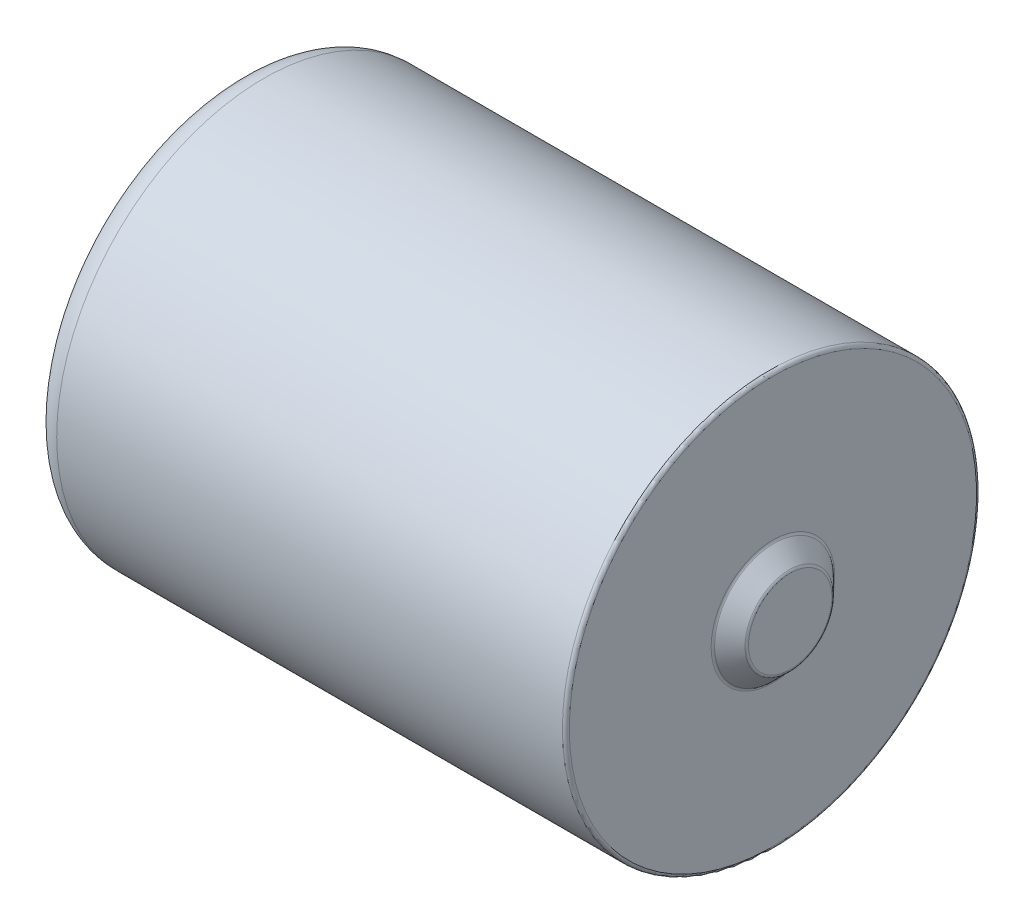
ISO-10303-21;
HEADER;
FILE_DESCRIPTION(('STEP AP214'),'2;1');
FILE_NAME('part.step','',(''),(''),'','','');
FILE_SCHEMA(('AUTOMOTIVE_DESIGN { 1 0 10303 214 1 1 1 1 }'));
ENDSEC;
DATA;
#1=APPLICATION_CONTEXT('core data for automotive mechanical design processes');
#2=APPLICATION_PROTOCOL_DEFINITION('international standard','automotive_design',2000,#1);
#3=PRODUCT_CONTEXT('',#1,'mechanical');
#4=PRODUCT('Part','Part','',(#3));
#5=PRODUCT_RELATED_PRODUCT_CATEGORY('part','',(#4));
#6=PRODUCT_DEFINITION_FORMATION('','',#4);
#7=PRODUCT_DEFINITION_CONTEXT('part definition',#1,'design');
#8=PRODUCT_DEFINITION('design','',#6,#7);
#9=PRODUCT_DEFINITION_SHAPE('','',#8);
#10=(LENGTH_UNIT() NAMED_UNIT(*) SI_UNIT(.MILLI.,.METRE.));
#11=(NAMED_UNIT(*) PLANE_ANGLE_UNIT() SI_UNIT($,.RADIAN.));
#12=(NAMED_UNIT(*) SI_UNIT($,.STERADIAN.) SOLID_ANGLE_UNIT());
#13=UNCERTAINTY_MEASURE_WITH_UNIT(LENGTH_MEASURE(1.E-05),#10,'distance_accuracy_value','');
#14=(GEOMETRIC_REPRESENTATION_CONTEXT(3) GLOBAL_UNCERTAINTY_ASSIGNED_CONTEXT((#13)) GLOBAL_UNIT_ASSIGNED_CONTEXT((#10,
#11,#12)) REPRESENTATION_CONTEXT('',''));
#15=CARTESIAN_POINT('',(0.,0.,0.));
#16=DIRECTION('',(0.,0.,1.));
#17=DIRECTION('',(1.,0.,0.));
#18=AXIS2_PLACEMENT_3D('',#15,#16,#17);
#19=CARTESIAN_POINT('',(0.,0.,0.));
#20=DIRECTION('',(-1.,0.,0.));
#21=DIRECTION('',(0.,0.,1.));
#22=AXIS2_PLACEMENT_3D('',#19,#20,#21);
#23=CYLINDRICAL_SURFACE('',#22,2.75);
#24=CARTESIAN_POINT('',(3.32679442143429,0.,0.));
#25=DIRECTION('',(1.,0.,0.));
#26=DIRECTION('',(0.,0.,-1.));
#27=AXIS2_PLACEMENT_3D('',#24,#25,#26);
#28=CIRCLE('',#27,2.75);
#29=CARTESIAN_POINT('',(3.32679442143429,0.,-2.75));
#30=VERTEX_POINT('',#29);
#31=EDGE_CURVE('E49',#30,#30,#28,.F.);
#32=ORIENTED_EDGE('',*,*,#31,.T.);
#33=EDGE_LOOP('',(#32));
#34=FACE_BOUND('',#33,.T.);
#35=CARTESIAN_POINT('',(3.62679442143429,0.,0.));
#36=DIRECTION('',(-1.,0.,0.));
#37=DIRECTION('',(0.,0.,1.));
#38=AXIS2_PLACEMENT_3D('',#35,#36,#37);
#39=CIRCLE('',#38,2.75);
#40=CARTESIAN_POINT('',(3.62679442143429,0.,2.75));
#41=VERTEX_POINT('',#40);
#42=EDGE_CURVE('E90',#41,#41,#39,.T.);
#43=ORIENTED_EDGE('',*,*,#42,.F.);
#44=EDGE_LOOP('',(#43));
#45=FACE_BOUND('',#44,.T.);
#46=ADVANCED_FACE('F35',(#34,#45),#23,.F.);
#47=CARTESIAN_POINT('',(3.12679442143429,2.75,0.));
#48=DIRECTION('',(1.,0.,0.));
#49=DIRECTION('',(0.,0.,-1.));
#50=AXIS2_PLACEMENT_3D('',#47,#48,#49);
#51=PLANE('',#50);
#52=CARTESIAN_POINT('',(3.12679442143429,0.,0.));
#53=DIRECTION('',(1.,0.,0.));
#54=DIRECTION('',(0.,0.,-1.));
#55=AXIS2_PLACEMENT_3D('',#52,#53,#54);
#56=CIRCLE('',#55,3.05);
#57=CARTESIAN_POINT('',(3.12679442143429,0.,-3.05));
#58=VERTEX_POINT('',#57);
#59=EDGE_CURVE('E60',#58,#58,#56,.F.);
#60=ORIENTED_EDGE('',*,*,#59,.T.);
#61=EDGE_LOOP('',(#60));
#62=FACE_BOUND('',#61,.T.);
#63=CARTESIAN_POINT('',(3.12679442143429,0.,0.));
#64=DIRECTION('',(1.,0.,0.));
#65=DIRECTION('',(0.,0.,-1.));
#66=AXIS2_PLACEMENT_3D('',#63,#64,#65);
#67=CIRCLE('',#66,2.95);
#68=CARTESIAN_POINT('',(3.12679442143429,0.,-2.95));
#69=VERTEX_POINT('',#68);
#70=EDGE_CURVE('E63',#69,#69,#67,.T.);
#71=ORIENTED_EDGE('',*,*,#70,.T.);
#72=EDGE_LOOP('',(#71));
#73=FACE_BOUND('',#72,.T.);
#74=ADVANCED_FACE('F97',(#62,#73),#51,.F.);
#75=CARTESIAN_POINT('',(0.,0.,0.));
#76=DIRECTION('',(-1.,0.,0.));
#77=DIRECTION('',(0.,0.,1.));
#78=AXIS2_PLACEMENT_3D('',#75,#76,#77);
#79=CYLINDRICAL_SURFACE('',#78,3.25);
#80=CARTESIAN_POINT('',(3.32679442143429,0.,0.));
#81=DIRECTION('',(1.,0.,0.));
#82=DIRECTION('',(0.,0.,-1.));
#83=AXIS2_PLACEMENT_3D('',#80,#81,#82);
#84=CIRCLE('',#83,3.25);
#85=CARTESIAN_POINT('',(3.32679442143429,0.,-3.25));
#86=VERTEX_POINT('',#85);
#87=EDGE_CURVE('E54',#86,#86,#84,.T.);
#88=ORIENTED_EDGE('',*,*,#87,.T.);
#89=EDGE_LOOP('',(#88));
#90=FACE_BOUND('',#89,.T.);
#91=CARTESIAN_POINT('',(3.92679442143429,0.,0.));
#92=DIRECTION('',(1.,0.,0.));
#93=DIRECTION('',(0.,0.,-1.));
#94=AXIS2_PLACEMENT_3D('',#91,#92,#93);
#95=CIRCLE('',#94,3.25);
#96=CARTESIAN_POINT('',(3.92679442143429,0.,-3.25));
#97=VERTEX_POINT('',#96);
#98=EDGE_CURVE('E57',#97,#97,#95,.F.);
#99=ORIENTED_EDGE('',*,*,#98,.T.);
#100=EDGE_LOOP('',(#99));
#101=FACE_BOUND('',#100,.T.);
#102=ADVANCED_FACE('F102',(#90,#101),#79,.T.);
#103=CARTESIAN_POINT('',(4.12679442143429,3.25,0.));
#104=DIRECTION('',(1.,0.,0.));
#105=DIRECTION('',(0.,0.,-1.));
#106=AXIS2_PLACEMENT_3D('',#103,#104,#105);
#107=PLANE('',#106);
#108=CARTESIAN_POINT('',(4.12679442143429,0.,0.));
#109=DIRECTION('',(1.,0.,0.));
#110=DIRECTION('',(0.,0.,-1.));
#111=AXIS2_PLACEMENT_3D('',#108,#109,#110);
#112=CIRCLE('',#111,3.45);
#113=CARTESIAN_POINT('',(4.12679442143429,0.,-3.45));
#114=VERTEX_POINT('',#113);
#115=EDGE_CURVE('E45',#114,#114,#112,.T.);
#116=ORIENTED_EDGE('',*,*,#115,.T.);
#117=EDGE_LOOP('',(#116));
#118=FACE_BOUND('',#117,.T.);
#119=CARTESIAN_POINT('',(4.12679442143429,0.,0.));
#120=DIRECTION('',(-1.,0.,0.));
#121=DIRECTION('',(0.,0.,1.));
#122=AXIS2_PLACEMENT_3D('',#119,#120,#121);
#123=CIRCLE('',#122,10.5);
#124=CARTESIAN_POINT('',(4.12679442143429,0.,10.5));
#125=VERTEX_POINT('',#124);
#126=EDGE_CURVE('E78',#125,#125,#123,.T.);
#127=ORIENTED_EDGE('',*,*,#126,.T.);
#128=EDGE_LOOP('',(#127));
#129=FACE_BOUND('',#128,.T.);
#130=ADVANCED_FACE('F160',(#118,#129),#107,.F.);
#131=CARTESIAN_POINT('',(5.62679442143429,0.,0.));
#132=DIRECTION('',(-1.,0.,0.));
#133=DIRECTION('',(0.,0.,1.));
#134=AXIS2_PLACEMENT_3D('',#131,#132,#133);
#135=TOROIDAL_SURFACE('',#134,10.5,1.5);
#136=ORIENTED_EDGE('',*,*,#126,.F.);
#137=EDGE_LOOP('',(#136));
#138=FACE_BOUND('',#137,.T.);
#139=CARTESIAN_POINT('',(5.62679442143429,0.,0.));
#140=DIRECTION('',(-1.,0.,0.));
#141=DIRECTION('',(0.,0.,1.));
#142=AXIS2_PLACEMENT_3D('',#139,#140,#141);
#143=CIRCLE('',#142,12.);
#144=CARTESIAN_POINT('',(5.62679442143429,0.,12.));
#145=VERTEX_POINT('',#144);
#146=EDGE_CURVE('E81',#145,#145,#143,.T.);
#147=ORIENTED_EDGE('',*,*,#146,.T.);
#148=EDGE_LOOP('',(#147));
#149=FACE_BOUND('',#148,.T.);
#150=ADVANCED_FACE('F157',(#138,#149),#135,.T.);
#151=CARTESIAN_POINT('',(0.,0.,0.));
#152=DIRECTION('',(-1.,0.,0.));
#153=DIRECTION('',(0.,0.,1.));
#154=AXIS2_PLACEMENT_3D('',#151,#152,#153);
#155=CYLINDRICAL_SURFACE('',#154,12.);
#156=CARTESIAN_POINT('',(34.9267944214343,0.,0.));
#157=DIRECTION('',(-1.,0.,0.));
#158=DIRECTION('',(0.,0.,1.));
#159=AXIS2_PLACEMENT_3D('',#156,#157,#158);
#160=CIRCLE('',#159,12.);
#161=CARTESIAN_POINT('',(34.9267944214343,0.,12.));
#162=VERTEX_POINT('',#161);
#163=EDGE_CURVE('E41',#162,#162,#160,.T.);
#164=ORIENTED_EDGE('',*,*,#163,.T.);
#165=EDGE_LOOP('',(#164));
#166=FACE_BOUND('',#165,.T.);
#167=ORIENTED_EDGE('',*,*,#146,.F.);
#168=EDGE_LOOP('',(#167));
#169=FACE_BOUND('',#168,.T.);
#170=ADVANCED_FACE('F154',(#166,#169),#155,.T.);
#171=CARTESIAN_POINT('',(35.1267944214343,12.,0.));
#172=DIRECTION('',(-1.,0.,0.));
#173=DIRECTION('',(0.,0.,1.));
#174=AXIS2_PLACEMENT_3D('',#171,#172,#173);
#175=PLANE('',#174);
#176=CARTESIAN_POINT('',(35.1267944214343,0.,0.));
#177=DIRECTION('',(-1.,0.,0.));
#178=DIRECTION('',(0.,0.,1.));
#179=AXIS2_PLACEMENT_3D('',#176,#177,#178);
#180=CIRCLE('',#179,11.8);
#181=CARTESIAN_POINT('',(35.1267944214343,0.,11.8));
#182=VERTEX_POINT('',#181);
#183=EDGE_CURVE('E10',#182,#182,#180,.F.);
#184=ORIENTED_EDGE('',*,*,#183,.T.);
#185=EDGE_LOOP('',(#184));
#186=FACE_BOUND('',#185,.T.);
#187=CARTESIAN_POINT('',(35.1267944214343,0.,0.));
#188=DIRECTION('',(-1.,0.,0.));
#189=DIRECTION('',(0.,0.,1.));
#190=AXIS2_PLACEMENT_3D('',#187,#188,#189);
#191=CIRCLE('',#190,3.58284271247462);
#192=CARTESIAN_POINT('',(35.1267944214343,0.,3.58284271247462));
#193=VERTEX_POINT('',#192);
#194=EDGE_CURVE('E75',#193,#193,#191,.T.);
#195=ORIENTED_EDGE('',*,*,#194,.T.);
#196=EDGE_LOOP('',(#195));
#197=FACE_BOUND('',#196,.T.);
#198=ADVANCED_FACE('F150',(#186,#197),#175,.F.);
#199=CARTESIAN_POINT('',(36.1267944214343,0.,0.));
#200=DIRECTION('',(-1.,0.,0.));
#201=DIRECTION('',(0.,0.,1.));
#202=AXIS2_PLACEMENT_3D('',#199,#200,#201);
#203=CONICAL_SURFACE('',#202,2.5,0.785398163397446);
#204=CARTESIAN_POINT('',(35.185373065197,0.,0.));
#205=DIRECTION('',(-1.,0.,0.));
#206=DIRECTION('',(0.,0.,1.));
#207=AXIS2_PLACEMENT_3D('',#204,#205,#206);
#208=CIRCLE('',#207,3.44142135623731);
#209=CARTESIAN_POINT('',(35.185373065197,0.,3.44142135623731));
#210=VERTEX_POINT('',#209);
#211=EDGE_CURVE('E69',#210,#210,#208,.F.);
#212=ORIENTED_EDGE('',*,*,#211,.T.);
#213=EDGE_LOOP('',(#212));
#214=FACE_BOUND('',#213,.T.);
#215=CARTESIAN_POINT('',(36.0682157776716,0.,0.));
#216=DIRECTION('',(1.,0.,0.));
#217=DIRECTION('',(0.,0.,-1.));
#218=AXIS2_PLACEMENT_3D('',#215,#216,#217);
#219=CIRCLE('',#218,2.55857864376269);
#220=CARTESIAN_POINT('',(36.0682157776716,0.,-2.55857864376269));
#221=VERTEX_POINT('',#220);
#222=EDGE_CURVE('E72',#221,#221,#219,.F.);
#223=ORIENTED_EDGE('',*,*,#222,.T.);
#224=EDGE_LOOP('',(#223));
#225=FACE_BOUND('',#224,.T.);
#226=ADVANCED_FACE('F146',(#214,#225),#203,.T.);
#227=CARTESIAN_POINT('',(36.1267944214343,2.5,0.));
#228=DIRECTION('',(-1.,0.,0.));
#229=DIRECTION('',(0.,0.,1.));
#230=AXIS2_PLACEMENT_3D('',#227,#228,#229);
#231=PLANE('',#230);
#232=CARTESIAN_POINT('',(36.1267944214343,0.,0.));
#233=DIRECTION('',(-1.,0.,0.));
#234=DIRECTION('',(0.,0.,1.));
#235=AXIS2_PLACEMENT_3D('',#232,#233,#234);
#236=CIRCLE('',#235,2.41715728752539);
#237=CARTESIAN_POINT('',(36.1267944214343,0.,2.41715728752539));
#238=VERTEX_POINT('',#237);
#239=EDGE_CURVE('E66',#238,#238,#236,.F.);
#240=ORIENTED_EDGE('',*,*,#239,.T.);
#241=EDGE_LOOP('',(#240));
#242=FACE_BOUND('',#241,.T.);
#243=ADVANCED_FACE('F142',(#242),#231,.F.);
#244=CARTESIAN_POINT('',(21.6466304474587,1.,0.));
#245=DIRECTION('',(1.,0.,0.));
#246=DIRECTION('',(0.,0.,-1.));
#247=AXIS2_PLACEMENT_3D('',#244,#245,#246);
#248=PLANE('',#247);
#249=CARTESIAN_POINT('',(21.6466304474587,0.,0.));
#250=DIRECTION('',(-1.,0.,0.));
#251=DIRECTION('',(0.,0.,1.));
#252=AXIS2_PLACEMENT_3D('',#249,#250,#251);
#253=CIRCLE('',#252,1.);
#254=CARTESIAN_POINT('',(21.6466304474587,0.,1.));
#255=VERTEX_POINT('',#254);
#256=EDGE_CURVE('E84',#255,#255,#253,.T.);
#257=ORIENTED_EDGE('',*,*,#256,.T.);
#258=EDGE_LOOP('',(#257));
#259=FACE_BOUND('',#258,.T.);
#260=ADVANCED_FACE('F138',(#259),#248,.F.);
#261=CARTESIAN_POINT('',(0.,0.,0.));
#262=DIRECTION('',(-1.,0.,0.));
#263=DIRECTION('',(0.,0.,1.));
#264=AXIS2_PLACEMENT_3D('',#261,#262,#263);
#265=CYLINDRICAL_SURFACE('',#264,1.);
#266=ORIENTED_EDGE('',*,*,#256,.F.);
#267=EDGE_LOOP('',(#266));
#268=FACE_BOUND('',#267,.T.);
#269=CARTESIAN_POINT('',(3.62679442143429,0.,0.));
#270=DIRECTION('',(-1.,0.,0.));
#271=DIRECTION('',(0.,0.,1.));
#272=AXIS2_PLACEMENT_3D('',#269,#270,#271);
#273=CIRCLE('',#272,1.);
#274=CARTESIAN_POINT('',(3.62679442143429,0.,1.));
#275=VERTEX_POINT('',#274);
#276=EDGE_CURVE('E87',#275,#275,#273,.T.);
#277=ORIENTED_EDGE('',*,*,#276,.T.);
#278=EDGE_LOOP('',(#277));
#279=FACE_BOUND('',#278,.T.);
#280=ADVANCED_FACE('F134',(#268,#279),#265,.F.);
#281=CARTESIAN_POINT('',(3.62679442143429,1.,0.));
#282=DIRECTION('',(1.,0.,0.));
#283=DIRECTION('',(0.,0.,-1.));
#284=AXIS2_PLACEMENT_3D('',#281,#282,#283);
#285=PLANE('',#284);
#286=ORIENTED_EDGE('',*,*,#276,.F.);
#287=EDGE_LOOP('',(#286));
#288=FACE_BOUND('',#287,.T.);
#289=ORIENTED_EDGE('',*,*,#42,.T.);
#290=EDGE_LOOP('',(#289));
#291=FACE_BOUND('',#290,.T.);
#292=ADVANCED_FACE('F94',(#288,#291),#285,.F.);
#293=CARTESIAN_POINT('',(35.3267944214343,0.,0.));
#294=DIRECTION('',(-1.,0.,0.));
#295=DIRECTION('',(0.,0.,1.));
#296=AXIS2_PLACEMENT_3D('',#293,#294,#295);
#297=TOROIDAL_SURFACE('',#296,3.58284271247462,0.2);
#298=ORIENTED_EDGE('',*,*,#211,.F.);
#299=EDGE_LOOP('',(#298));
#300=FACE_BOUND('',#299,.T.);
#301=ORIENTED_EDGE('',*,*,#194,.F.);
#302=EDGE_LOOP('',(#301));
#303=FACE_BOUND('',#302,.T.);
#304=ADVANCED_FACE('F127',(#300,#303),#297,.F.);
#305=CARTESIAN_POINT('',(35.9267944214343,0.,0.));
#306=DIRECTION('',(-1.,0.,0.));
#307=DIRECTION('',(0.,0.,1.));
#308=AXIS2_PLACEMENT_3D('',#305,#306,#307);
#309=TOROIDAL_SURFACE('',#308,2.41715728752539,0.2);
#310=ORIENTED_EDGE('',*,*,#239,.F.);
#311=EDGE_LOOP('',(#310));
#312=FACE_BOUND('',#311,.T.);
#313=ORIENTED_EDGE('',*,*,#222,.F.);
#314=EDGE_LOOP('',(#313));
#315=FACE_BOUND('',#314,.T.);
#316=ADVANCED_FACE('F119',(#312,#315),#309,.T.);
#317=CARTESIAN_POINT('',(3.32679442143429,0.,0.));
#318=DIRECTION('',(1.,0.,0.));
#319=DIRECTION('',(0.,0.,-1.));
#320=AXIS2_PLACEMENT_3D('',#317,#318,#319);
#321=TOROIDAL_SURFACE('',#320,3.05,0.2);
#322=ORIENTED_EDGE('',*,*,#87,.F.);
#323=EDGE_LOOP('',(#322));
#324=FACE_BOUND('',#323,.T.);
#325=ORIENTED_EDGE('',*,*,#59,.F.);
#326=EDGE_LOOP('',(#325));
#327=FACE_BOUND('',#326,.T.);
#328=ADVANCED_FACE('F109',(#324,#327),#321,.T.);
#329=CARTESIAN_POINT('',(3.32679442143429,0.,0.));
#330=DIRECTION('',(1.,0.,0.));
#331=DIRECTION('',(0.,0.,-1.));
#332=AXIS2_PLACEMENT_3D('',#329,#330,#331);
#333=TOROIDAL_SURFACE('',#332,2.95,0.2);
#334=ORIENTED_EDGE('',*,*,#70,.F.);
#335=EDGE_LOOP('',(#334));
#336=FACE_BOUND('',#335,.T.);
#337=ORIENTED_EDGE('',*,*,#31,.F.);
#338=EDGE_LOOP('',(#337));
#339=FACE_BOUND('',#338,.T.);
#340=ADVANCED_FACE('F106',(#336,#339),#333,.T.);
#341=CARTESIAN_POINT('',(3.92679442143429,0.,0.));
#342=DIRECTION('',(1.,0.,0.));
#343=DIRECTION('',(0.,0.,-1.));
#344=AXIS2_PLACEMENT_3D('',#341,#342,#343);
#345=TOROIDAL_SURFACE('',#344,3.45,0.2);
#346=ORIENTED_EDGE('',*,*,#115,.F.);
#347=EDGE_LOOP('',(#346));
#348=FACE_BOUND('',#347,.T.);
#349=ORIENTED_EDGE('',*,*,#98,.F.);
#350=EDGE_LOOP('',(#349));
#351=FACE_BOUND('',#350,.T.);
#352=ADVANCED_FACE('F108',(#348,#351),#345,.F.);
#353=CARTESIAN_POINT('',(34.9267944214343,0.,0.));
#354=DIRECTION('',(-1.,0.,0.));
#355=DIRECTION('',(0.,0.,1.));
#356=AXIS2_PLACEMENT_3D('',#353,#354,#355);
#357=TOROIDAL_SURFACE('',#356,11.8,0.2);
#358=ORIENTED_EDGE('',*,*,#183,.F.);
#359=EDGE_LOOP('',(#358));
#360=FACE_BOUND('',#359,.T.);
#361=ORIENTED_EDGE('',*,*,#163,.F.);
#362=EDGE_LOOP('',(#361));
#363=FACE_BOUND('',#362,.T.);
#364=ADVANCED_FACE('F116',(#360,#363),#357,.T.);
#365=CLOSED_SHELL('',(#46,#74,#102,#130,#150,#170,#198,#226,#243,#260,#280,#292,#304,#316,#328,
#340,#352,#364));
#366=MANIFOLD_SOLID_BREP('B2',#365);
#367=ADVANCED_BREP_SHAPE_REPRESENTATION('',(#18,#366),#14);
#368=SHAPE_DEFINITION_REPRESENTATION(#9,#367);
ENDSEC;
END-ISO-10303-21;
